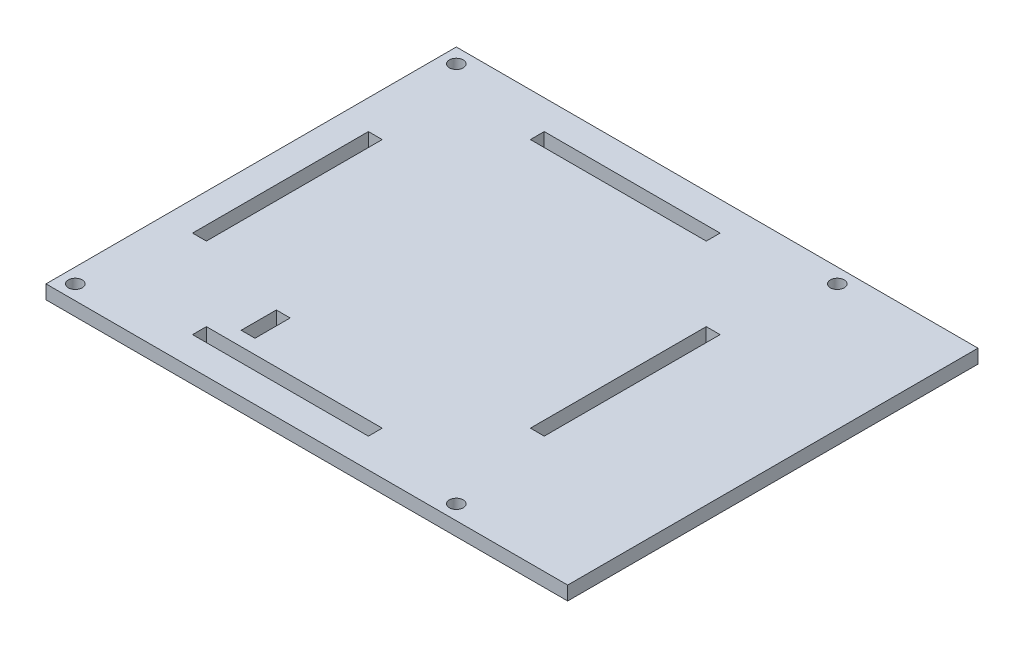
ISO-10303-21;
HEADER;
FILE_DESCRIPTION(('STEP AP214'),'2;1');
FILE_NAME('part.step','',(''),(''),'','','');
FILE_SCHEMA(('AUTOMOTIVE_DESIGN { 1 0 10303 214 1 1 1 1 }'));
ENDSEC;
DATA;
#1=APPLICATION_CONTEXT('core data for automotive mechanical design processes');
#2=APPLICATION_PROTOCOL_DEFINITION('international standard','automotive_design',2000,#1);
#3=PRODUCT_CONTEXT('',#1,'mechanical');
#4=PRODUCT('Part','Part','',(#3));
#5=PRODUCT_RELATED_PRODUCT_CATEGORY('part','',(#4));
#6=PRODUCT_DEFINITION_FORMATION('','',#4);
#7=PRODUCT_DEFINITION_CONTEXT('part definition',#1,'design');
#8=PRODUCT_DEFINITION('design','',#6,#7);
#9=PRODUCT_DEFINITION_SHAPE('','',#8);
#10=(LENGTH_UNIT() NAMED_UNIT(*) SI_UNIT(.MILLI.,.METRE.));
#11=(NAMED_UNIT(*) PLANE_ANGLE_UNIT() SI_UNIT($,.RADIAN.));
#12=(NAMED_UNIT(*) SI_UNIT($,.STERADIAN.) SOLID_ANGLE_UNIT());
#13=UNCERTAINTY_MEASURE_WITH_UNIT(LENGTH_MEASURE(1.E-05),#10,'distance_accuracy_value','');
#14=(GEOMETRIC_REPRESENTATION_CONTEXT(3) GLOBAL_UNCERTAINTY_ASSIGNED_CONTEXT((#13)) GLOBAL_UNIT_ASSIGNED_CONTEXT((#10,
#11,#12)) REPRESENTATION_CONTEXT('',''));
#15=CARTESIAN_POINT('',(0.,0.,0.));
#16=DIRECTION('',(0.,0.,1.));
#17=DIRECTION('',(1.,0.,0.));
#18=AXIS2_PLACEMENT_3D('',#15,#16,#17);
#19=CARTESIAN_POINT('',(0.,3.,0.));
#20=DIRECTION('',(0.,-1.,0.));
#21=DIRECTION('',(0.,0.,-1.));
#22=AXIS2_PLACEMENT_3D('',#19,#20,#21);
#23=PLANE('',#22);
#24=DIRECTION('',(0.,0.,1.));
#25=VECTOR('',#24,1.);
#26=CARTESIAN_POINT('',(-14.6000000000003,3.,24.4002499999995));
#27=LINE('',#26,#25);
#28=CARTESIAN_POINT('',(-14.6000000000003,3.,24.4002499999995));
#29=VERTEX_POINT('',#28);
#30=CARTESIAN_POINT('',(-14.6000000000003,3.,32.0202499999995));
#31=VERTEX_POINT('',#30);
#32=EDGE_CURVE('E234',#29,#31,#27,.T.);
#33=ORIENTED_EDGE('',*,*,#32,.F.);
#34=DIRECTION('',(-1.,0.,0.));
#35=VECTOR('',#34,1.);
#36=CARTESIAN_POINT('',(-14.6000000000003,3.,24.4002499999995));
#37=LINE('',#36,#35);
#38=CARTESIAN_POINT('',(-11.6000000000003,3.,24.4002499999995));
#39=VERTEX_POINT('',#38);
#40=EDGE_CURVE('E224',#39,#29,#37,.T.);
#41=ORIENTED_EDGE('',*,*,#40,.F.);
#42=DIRECTION('',(0.,0.,-1.));
#43=VECTOR('',#42,1.);
#44=CARTESIAN_POINT('',(-11.6000000000003,3.,24.4002499999995));
#45=LINE('',#44,#43);
#46=CARTESIAN_POINT('',(-11.6000000000003,3.,32.0202499999995));
#47=VERTEX_POINT('',#46);
#48=EDGE_CURVE('E238',#47,#39,#45,.T.);
#49=ORIENTED_EDGE('',*,*,#48,.F.);
#50=DIRECTION('',(1.,0.,0.));
#51=VECTOR('',#50,1.);
#52=CARTESIAN_POINT('',(-14.6000000000003,3.,32.0202499999995));
#53=LINE('',#52,#51);
#54=EDGE_CURVE('E60',#31,#47,#53,.T.);
#55=ORIENTED_EDGE('',*,*,#54,.F.);
#56=EDGE_LOOP('',(#33,#41,#49,#55));
#57=FACE_BOUND('',#56,.T.);
#58=DIRECTION('',(1.,0.,0.));
#59=VECTOR('',#58,1.);
#60=CARTESIAN_POINT('',(19.05,3.,38.0999999999995));
#61=LINE('',#60,#59);
#62=CARTESIAN_POINT('',(-19.05,3.,38.0999999999995));
#63=VERTEX_POINT('',#62);
#64=CARTESIAN_POINT('',(19.05,3.,38.0999999999995));
#65=VERTEX_POINT('',#64);
#66=EDGE_CURVE('E312',#63,#65,#61,.T.);
#67=ORIENTED_EDGE('',*,*,#66,.F.);
#68=DIRECTION('',(0.,0.,1.));
#69=VECTOR('',#68,1.);
#70=CARTESIAN_POINT('',(-19.05,3.,35.0999999999995));
#71=LINE('',#70,#69);
#72=CARTESIAN_POINT('',(-19.05,3.,35.0999999999995));
#73=VERTEX_POINT('',#72);
#74=EDGE_CURVE('E323',#73,#63,#71,.T.);
#75=ORIENTED_EDGE('',*,*,#74,.F.);
#76=DIRECTION('',(-1.,0.,0.));
#77=VECTOR('',#76,1.);
#78=CARTESIAN_POINT('',(19.05,3.,35.0999999999995));
#79=LINE('',#78,#77);
#80=CARTESIAN_POINT('',(19.05,3.,35.0999999999995));
#81=VERTEX_POINT('',#80);
#82=EDGE_CURVE('E319',#81,#73,#79,.T.);
#83=ORIENTED_EDGE('',*,*,#82,.F.);
#84=DIRECTION('',(0.,0.,-1.));
#85=VECTOR('',#84,1.);
#86=CARTESIAN_POINT('',(19.05,3.,35.0999999999995));
#87=LINE('',#86,#85);
#88=EDGE_CURVE('E315',#65,#81,#87,.T.);
#89=ORIENTED_EDGE('',*,*,#88,.F.);
#90=EDGE_LOOP('',(#67,#75,#83,#89));
#91=FACE_BOUND('',#90,.T.);
#92=CARTESIAN_POINT('',(-41.2750000000004,3.,41.2749999999996));
#93=DIRECTION('',(0.,1.,0.));
#94=DIRECTION('',(0.,0.,1.));
#95=AXIS2_PLACEMENT_3D('',#92,#93,#94);
#96=CIRCLE('',#95,1.50000000000001);
#97=CARTESIAN_POINT('',(-41.2750000000004,3.,42.7749999999996));
#98=VERTEX_POINT('',#97);
#99=EDGE_CURVE('E398',#98,#98,#96,.T.);
#100=ORIENTED_EDGE('',*,*,#99,.F.);
#101=EDGE_LOOP('',(#100));
#102=FACE_BOUND('',#101,.T.);
#103=CARTESIAN_POINT('',(41.275,3.,41.2749999999999));
#104=DIRECTION('',(0.,1.,0.));
#105=DIRECTION('',(0.,0.,1.));
#106=AXIS2_PLACEMENT_3D('',#103,#104,#105);
#107=CIRCLE('',#106,1.50000000000039);
#108=CARTESIAN_POINT('',(41.275,3.,42.7750000000003));
#109=VERTEX_POINT('',#108);
#110=EDGE_CURVE('E406',#109,#109,#107,.T.);
#111=ORIENTED_EDGE('',*,*,#110,.F.);
#112=EDGE_LOOP('',(#111));
#113=FACE_BOUND('',#112,.T.);
#114=CARTESIAN_POINT('',(41.2750000000002,3.,-41.2749999999999));
#115=DIRECTION('',(0.,1.,0.));
#116=DIRECTION('',(0.,0.,1.));
#117=AXIS2_PLACEMENT_3D('',#114,#115,#116);
#118=CIRCLE('',#117,1.5);
#119=CARTESIAN_POINT('',(41.2750000000002,3.,-39.7749999999999));
#120=VERTEX_POINT('',#119);
#121=EDGE_CURVE('E414',#120,#120,#118,.T.);
#122=ORIENTED_EDGE('',*,*,#121,.F.);
#123=EDGE_LOOP('',(#122));
#124=FACE_BOUND('',#123,.T.);
#125=CARTESIAN_POINT('',(-41.275,3.,-41.2750000000001));
#126=DIRECTION('',(0.,1.,0.));
#127=DIRECTION('',(0.,0.,1.));
#128=AXIS2_PLACEMENT_3D('',#125,#126,#127);
#129=CIRCLE('',#128,1.49999999999997);
#130=CARTESIAN_POINT('',(-41.275,3.,-39.7750000000001));
#131=VERTEX_POINT('',#130);
#132=EDGE_CURVE('E422',#131,#131,#129,.T.);
#133=ORIENTED_EDGE('',*,*,#132,.F.);
#134=EDGE_LOOP('',(#133));
#135=FACE_BOUND('',#134,.T.);
#136=DIRECTION('',(0.,0.,-1.));
#137=VECTOR('',#136,1.);
#138=CARTESIAN_POINT('',(19.049999999999,3.,-35.1));
#139=LINE('',#138,#137);
#140=CARTESIAN_POINT('',(19.049999999999,3.,-35.1));
#141=VERTEX_POINT('',#140);
#142=CARTESIAN_POINT('',(19.049999999999,3.,-38.1));
#143=VERTEX_POINT('',#142);
#144=EDGE_CURVE('E430',#141,#143,#139,.T.);
#145=ORIENTED_EDGE('',*,*,#144,.F.);
#146=DIRECTION('',(1.,0.,0.));
#147=VECTOR('',#146,1.);
#148=CARTESIAN_POINT('',(-19.050000000001,3.,-35.1));
#149=LINE('',#148,#147);
#150=CARTESIAN_POINT('',(-19.050000000001,3.,-35.1));
#151=VERTEX_POINT('',#150);
#152=EDGE_CURVE('E441',#151,#141,#149,.T.);
#153=ORIENTED_EDGE('',*,*,#152,.F.);
#154=DIRECTION('',(0.,0.,1.));
#155=VECTOR('',#154,1.);
#156=CARTESIAN_POINT('',(-19.050000000001,3.,-35.1));
#157=LINE('',#156,#155);
#158=CARTESIAN_POINT('',(-19.050000000001,3.,-38.1));
#159=VERTEX_POINT('',#158);
#160=EDGE_CURVE('E437',#159,#151,#157,.T.);
#161=ORIENTED_EDGE('',*,*,#160,.F.);
#162=DIRECTION('',(-1.,0.,0.));
#163=VECTOR('',#162,1.);
#164=CARTESIAN_POINT('',(-19.050000000001,3.,-38.1));
#165=LINE('',#164,#163);
#166=EDGE_CURVE('E433',#143,#159,#165,.T.);
#167=ORIENTED_EDGE('',*,*,#166,.F.);
#168=EDGE_LOOP('',(#145,#153,#161,#167));
#169=FACE_BOUND('',#168,.T.);
#170=DIRECTION('',(1.,0.,0.));
#171=VECTOR('',#170,1.);
#172=CARTESIAN_POINT('',(-44.45,3.,44.45));
#173=LINE('',#172,#171);
#174=CARTESIAN_POINT('',(-44.45,3.,44.45));
#175=VERTEX_POINT('',#174);
#176=CARTESIAN_POINT('',(68.58,3.,44.45));
#177=VERTEX_POINT('',#176);
#178=EDGE_CURVE('E480',#175,#177,#173,.T.);
#179=ORIENTED_EDGE('',*,*,#178,.T.);
#180=DIRECTION('',(0.,0.,1.));
#181=VECTOR('',#180,1.);
#182=CARTESIAN_POINT('',(68.58,3.,-44.45));
#183=LINE('',#182,#181);
#184=CARTESIAN_POINT('',(68.58,3.,-44.45));
#185=VERTEX_POINT('',#184);
#186=EDGE_CURVE('E264',#185,#177,#183,.T.);
#187=ORIENTED_EDGE('',*,*,#186,.F.);
#188=DIRECTION('',(-1.,0.,0.));
#189=VECTOR('',#188,1.);
#190=CARTESIAN_POINT('',(-44.45,3.,-44.45));
#191=LINE('',#190,#189);
#192=CARTESIAN_POINT('',(-44.45,3.,-44.45));
#193=VERTEX_POINT('',#192);
#194=EDGE_CURVE('E473',#185,#193,#191,.T.);
#195=ORIENTED_EDGE('',*,*,#194,.T.);
#196=DIRECTION('',(0.,0.,1.));
#197=VECTOR('',#196,1.);
#198=CARTESIAN_POINT('',(-44.45,3.,44.45));
#199=LINE('',#198,#197);
#200=EDGE_CURVE('E476',#193,#175,#199,.T.);
#201=ORIENTED_EDGE('',*,*,#200,.T.);
#202=EDGE_LOOP('',(#179,#187,#195,#201));
#203=FACE_BOUND('',#202,.T.);
#204=DIRECTION('',(0.,0.,-1.));
#205=VECTOR('',#204,1.);
#206=CARTESIAN_POINT('',(38.0999999999992,3.,-19.0500000000008));
#207=LINE('',#206,#205);
#208=CARTESIAN_POINT('',(38.0999999999992,3.,19.0499999999992));
#209=VERTEX_POINT('',#208);
#210=CARTESIAN_POINT('',(38.0999999999992,3.,-19.0500000000008));
#211=VERTEX_POINT('',#210);
#212=EDGE_CURVE('E355',#209,#211,#207,.T.);
#213=ORIENTED_EDGE('',*,*,#212,.F.);
#214=DIRECTION('',(1.,0.,0.));
#215=VECTOR('',#214,1.);
#216=CARTESIAN_POINT('',(35.0999999999992,3.,19.0499999999992));
#217=LINE('',#216,#215);
#218=CARTESIAN_POINT('',(35.0999999999992,3.,19.0499999999992));
#219=VERTEX_POINT('',#218);
#220=EDGE_CURVE('E366',#219,#209,#217,.T.);
#221=ORIENTED_EDGE('',*,*,#220,.F.);
#222=DIRECTION('',(0.,0.,1.));
#223=VECTOR('',#222,1.);
#224=CARTESIAN_POINT('',(35.0999999999992,3.,-19.0500000000008));
#225=LINE('',#224,#223);
#226=CARTESIAN_POINT('',(35.0999999999992,3.,-19.0500000000008));
#227=VERTEX_POINT('',#226);
#228=EDGE_CURVE('E362',#227,#219,#225,.T.);
#229=ORIENTED_EDGE('',*,*,#228,.F.);
#230=DIRECTION('',(-1.,0.,0.));
#231=VECTOR('',#230,1.);
#232=CARTESIAN_POINT('',(35.0999999999992,3.,-19.0500000000008));
#233=LINE('',#232,#231);
#234=EDGE_CURVE('E358',#211,#227,#233,.T.);
#235=ORIENTED_EDGE('',*,*,#234,.F.);
#236=EDGE_LOOP('',(#213,#221,#229,#235));
#237=FACE_BOUND('',#236,.T.);
#238=DIRECTION('',(0.,0.,1.));
#239=VECTOR('',#238,1.);
#240=CARTESIAN_POINT('',(-38.1000000000003,3.,19.0500000000003));
#241=LINE('',#240,#239);
#242=CARTESIAN_POINT('',(-38.0999999999998,3.,-19.0500000000004));
#243=VERTEX_POINT('',#242);
#244=CARTESIAN_POINT('',(-38.1000000000003,3.,19.0500000000003));
#245=VERTEX_POINT('',#244);
#246=EDGE_CURVE('E269',#243,#245,#241,.T.);
#247=ORIENTED_EDGE('',*,*,#246,.F.);
#248=DIRECTION('',(-1.,0.,0.));
#249=VECTOR('',#248,1.);
#250=CARTESIAN_POINT('',(-35.0999999999998,3.,-19.0500000000004));
#251=LINE('',#250,#249);
#252=CARTESIAN_POINT('',(-35.0999999999998,3.,-19.0500000000004));
#253=VERTEX_POINT('',#252);
#254=EDGE_CURVE('E280',#253,#243,#251,.T.);
#255=ORIENTED_EDGE('',*,*,#254,.F.);
#256=DIRECTION('',(0.,0.,-1.));
#257=VECTOR('',#256,1.);
#258=CARTESIAN_POINT('',(-35.1000000000003,3.,19.0500000000003));
#259=LINE('',#258,#257);
#260=CARTESIAN_POINT('',(-35.1000000000003,3.,19.0500000000003));
#261=VERTEX_POINT('',#260);
#262=EDGE_CURVE('E276',#261,#253,#259,.T.);
#263=ORIENTED_EDGE('',*,*,#262,.F.);
#264=DIRECTION('',(1.,0.,0.));
#265=VECTOR('',#264,1.);
#266=CARTESIAN_POINT('',(-35.1000000000003,3.,19.0500000000003));
#267=LINE('',#266,#265);
#268=EDGE_CURVE('E272',#245,#261,#267,.T.);
#269=ORIENTED_EDGE('',*,*,#268,.F.);
#270=EDGE_LOOP('',(#247,#255,#263,#269));
#271=FACE_BOUND('',#270,.T.);
#272=ADVANCED_FACE('F44',(#57,#91,#102,#113,#124,#135,#169,#203,#237,#271),#23,.F.);
#273=CARTESIAN_POINT('',(0.,0.,0.));
#274=DIRECTION('',(0.,-1.,0.));
#275=DIRECTION('',(0.,0.,-1.));
#276=AXIS2_PLACEMENT_3D('',#273,#274,#275);
#277=PLANE('',#276);
#278=DIRECTION('',(-1.,0.,0.));
#279=VECTOR('',#278,1.);
#280=CARTESIAN_POINT('',(-14.6000000000003,0.,24.4002499999995));
#281=LINE('',#280,#279);
#282=CARTESIAN_POINT('',(-11.6000000000003,0.,24.4002499999995));
#283=VERTEX_POINT('',#282);
#284=CARTESIAN_POINT('',(-14.6000000000003,0.,24.4002499999995));
#285=VERTEX_POINT('',#284);
#286=EDGE_CURVE('E221',#283,#285,#281,.T.);
#287=ORIENTED_EDGE('',*,*,#286,.T.);
#288=DIRECTION('',(0.,0.,1.));
#289=VECTOR('',#288,1.);
#290=CARTESIAN_POINT('',(-14.6000000000003,0.,24.4002499999995));
#291=LINE('',#290,#289);
#292=CARTESIAN_POINT('',(-14.6000000000003,0.,32.0202499999995));
#293=VERTEX_POINT('',#292);
#294=EDGE_CURVE('E207',#285,#293,#291,.T.);
#295=ORIENTED_EDGE('',*,*,#294,.T.);
#296=DIRECTION('',(1.,0.,0.));
#297=VECTOR('',#296,1.);
#298=CARTESIAN_POINT('',(-14.6000000000003,0.,32.0202499999995));
#299=LINE('',#298,#297);
#300=CARTESIAN_POINT('',(-11.6000000000003,0.,32.0202499999995));
#301=VERTEX_POINT('',#300);
#302=EDGE_CURVE('E243',#293,#301,#299,.T.);
#303=ORIENTED_EDGE('',*,*,#302,.T.);
#304=DIRECTION('',(0.,0.,-1.));
#305=VECTOR('',#304,1.);
#306=CARTESIAN_POINT('',(-11.6000000000003,0.,24.4002499999995));
#307=LINE('',#306,#305);
#308=EDGE_CURVE('E230',#301,#283,#307,.T.);
#309=ORIENTED_EDGE('',*,*,#308,.T.);
#310=EDGE_LOOP('',(#287,#295,#303,#309));
#311=FACE_BOUND('',#310,.T.);
#312=CARTESIAN_POINT('',(41.275,0.,41.2749999999999));
#313=DIRECTION('',(0.,1.,0.));
#314=DIRECTION('',(0.,0.,1.));
#315=AXIS2_PLACEMENT_3D('',#312,#313,#314);
#316=CIRCLE('',#315,1.50000000000039);
#317=CARTESIAN_POINT('',(41.275,0.,42.7750000000003));
#318=VERTEX_POINT('',#317);
#319=EDGE_CURVE('E402',#318,#318,#316,.T.);
#320=ORIENTED_EDGE('',*,*,#319,.T.);
#321=EDGE_LOOP('',(#320));
#322=FACE_BOUND('',#321,.T.);
#323=CARTESIAN_POINT('',(-41.275,0.,-41.2750000000001));
#324=DIRECTION('',(0.,1.,0.));
#325=DIRECTION('',(0.,0.,1.));
#326=AXIS2_PLACEMENT_3D('',#323,#324,#325);
#327=CIRCLE('',#326,1.49999999999997);
#328=CARTESIAN_POINT('',(-41.275,0.,-39.7750000000001));
#329=VERTEX_POINT('',#328);
#330=EDGE_CURVE('E418',#329,#329,#327,.T.);
#331=ORIENTED_EDGE('',*,*,#330,.T.);
#332=EDGE_LOOP('',(#331));
#333=FACE_BOUND('',#332,.T.);
#334=DIRECTION('',(-1.,0.,0.));
#335=VECTOR('',#334,1.);
#336=CARTESIAN_POINT('',(-44.45,0.,-44.45));
#337=LINE('',#336,#335);
#338=CARTESIAN_POINT('',(68.58,0.,-44.45));
#339=VERTEX_POINT('',#338);
#340=CARTESIAN_POINT('',(-44.45,0.,-44.45));
#341=VERTEX_POINT('',#340);
#342=EDGE_CURVE('E472',#339,#341,#337,.T.);
#343=ORIENTED_EDGE('',*,*,#342,.F.);
#344=DIRECTION('',(0.,0.,-1.));
#345=VECTOR('',#344,1.);
#346=CARTESIAN_POINT('',(68.58,0.,44.45));
#347=LINE('',#346,#345);
#348=CARTESIAN_POINT('',(68.58,0.,44.45));
#349=VERTEX_POINT('',#348);
#350=EDGE_CURVE('E256',#349,#339,#347,.T.);
#351=ORIENTED_EDGE('',*,*,#350,.F.);
#352=DIRECTION('',(1.,0.,0.));
#353=VECTOR('',#352,1.);
#354=CARTESIAN_POINT('',(-44.45,0.,44.45));
#355=LINE('',#354,#353);
#356=CARTESIAN_POINT('',(-44.45,0.,44.45));
#357=VERTEX_POINT('',#356);
#358=EDGE_CURVE('E477',#357,#349,#355,.T.);
#359=ORIENTED_EDGE('',*,*,#358,.F.);
#360=DIRECTION('',(0.,0.,1.));
#361=VECTOR('',#360,1.);
#362=CARTESIAN_POINT('',(-44.45,0.,44.45));
#363=LINE('',#362,#361);
#364=EDGE_CURVE('E485',#341,#357,#363,.T.);
#365=ORIENTED_EDGE('',*,*,#364,.F.);
#366=EDGE_LOOP('',(#343,#351,#359,#365));
#367=FACE_BOUND('',#366,.T.);
#368=DIRECTION('',(1.,0.,0.));
#369=VECTOR('',#368,1.);
#370=CARTESIAN_POINT('',(-19.050000000001,0.,-35.1));
#371=LINE('',#370,#369);
#372=CARTESIAN_POINT('',(-19.050000000001,0.,-35.1));
#373=VERTEX_POINT('',#372);
#374=CARTESIAN_POINT('',(19.049999999999,0.,-35.1));
#375=VERTEX_POINT('',#374);
#376=EDGE_CURVE('E434',#373,#375,#371,.T.);
#377=ORIENTED_EDGE('',*,*,#376,.T.);
#378=DIRECTION('',(0.,0.,-1.));
#379=VECTOR('',#378,1.);
#380=CARTESIAN_POINT('',(19.049999999999,0.,-35.1));
#381=LINE('',#380,#379);
#382=CARTESIAN_POINT('',(19.049999999999,0.,-38.1));
#383=VERTEX_POINT('',#382);
#384=EDGE_CURVE('E426',#375,#383,#381,.T.);
#385=ORIENTED_EDGE('',*,*,#384,.T.);
#386=DIRECTION('',(-1.,0.,0.));
#387=VECTOR('',#386,1.);
#388=CARTESIAN_POINT('',(-19.050000000001,0.,-38.1));
#389=LINE('',#388,#387);
#390=CARTESIAN_POINT('',(-19.050000000001,0.,-38.1));
#391=VERTEX_POINT('',#390);
#392=EDGE_CURVE('E448',#383,#391,#389,.T.);
#393=ORIENTED_EDGE('',*,*,#392,.T.);
#394=DIRECTION('',(0.,0.,1.));
#395=VECTOR('',#394,1.);
#396=CARTESIAN_POINT('',(-19.050000000001,0.,-35.1));
#397=LINE('',#396,#395);
#398=EDGE_CURVE('E452',#391,#373,#397,.T.);
#399=ORIENTED_EDGE('',*,*,#398,.T.);
#400=EDGE_LOOP('',(#377,#385,#393,#399));
#401=FACE_BOUND('',#400,.T.);
#402=CARTESIAN_POINT('',(41.2750000000002,0.,-41.2749999999999));
#403=DIRECTION('',(0.,1.,0.));
#404=DIRECTION('',(0.,0.,1.));
#405=AXIS2_PLACEMENT_3D('',#402,#403,#404);
#406=CIRCLE('',#405,1.5);
#407=CARTESIAN_POINT('',(41.2750000000002,0.,-39.7749999999999));
#408=VERTEX_POINT('',#407);
#409=EDGE_CURVE('E410',#408,#408,#406,.T.);
#410=ORIENTED_EDGE('',*,*,#409,.T.);
#411=EDGE_LOOP('',(#410));
#412=FACE_BOUND('',#411,.T.);
#413=CARTESIAN_POINT('',(-41.2750000000004,0.,41.2749999999996));
#414=DIRECTION('',(0.,1.,0.));
#415=DIRECTION('',(0.,0.,1.));
#416=AXIS2_PLACEMENT_3D('',#413,#414,#415);
#417=CIRCLE('',#416,1.50000000000001);
#418=CARTESIAN_POINT('',(-41.2750000000004,0.,42.7749999999996));
#419=VERTEX_POINT('',#418);
#420=EDGE_CURVE('E397',#419,#419,#417,.T.);
#421=ORIENTED_EDGE('',*,*,#420,.T.);
#422=EDGE_LOOP('',(#421));
#423=FACE_BOUND('',#422,.T.);
#424=DIRECTION('',(1.,0.,0.));
#425=VECTOR('',#424,1.);
#426=CARTESIAN_POINT('',(35.0999999999992,0.,19.0499999999992));
#427=LINE('',#426,#425);
#428=CARTESIAN_POINT('',(35.0999999999992,0.,19.0499999999992));
#429=VERTEX_POINT('',#428);
#430=CARTESIAN_POINT('',(38.0999999999992,0.,19.0499999999992));
#431=VERTEX_POINT('',#430);
#432=EDGE_CURVE('E359',#429,#431,#427,.T.);
#433=ORIENTED_EDGE('',*,*,#432,.T.);
#434=DIRECTION('',(0.,0.,-1.));
#435=VECTOR('',#434,1.);
#436=CARTESIAN_POINT('',(38.0999999999992,0.,-19.0500000000008));
#437=LINE('',#436,#435);
#438=CARTESIAN_POINT('',(38.0999999999992,0.,-19.0500000000008));
#439=VERTEX_POINT('',#438);
#440=EDGE_CURVE('E354',#431,#439,#437,.T.);
#441=ORIENTED_EDGE('',*,*,#440,.T.);
#442=DIRECTION('',(-1.,0.,0.));
#443=VECTOR('',#442,1.);
#444=CARTESIAN_POINT('',(35.0999999999992,0.,-19.0500000000008));
#445=LINE('',#444,#443);
#446=CARTESIAN_POINT('',(35.0999999999992,0.,-19.0500000000008));
#447=VERTEX_POINT('',#446);
#448=EDGE_CURVE('E373',#439,#447,#445,.T.);
#449=ORIENTED_EDGE('',*,*,#448,.T.);
#450=DIRECTION('',(0.,0.,1.));
#451=VECTOR('',#450,1.);
#452=CARTESIAN_POINT('',(35.0999999999992,0.,-19.0500000000008));
#453=LINE('',#452,#451);
#454=EDGE_CURVE('E377',#447,#429,#453,.T.);
#455=ORIENTED_EDGE('',*,*,#454,.T.);
#456=EDGE_LOOP('',(#433,#441,#449,#455));
#457=FACE_BOUND('',#456,.T.);
#458=DIRECTION('',(0.,0.,1.));
#459=VECTOR('',#458,1.);
#460=CARTESIAN_POINT('',(-19.05,0.,35.0999999999995));
#461=LINE('',#460,#459);
#462=CARTESIAN_POINT('',(-19.05,0.,35.0999999999995));
#463=VERTEX_POINT('',#462);
#464=CARTESIAN_POINT('',(-19.05,0.,38.0999999999995));
#465=VERTEX_POINT('',#464);
#466=EDGE_CURVE('E316',#463,#465,#461,.T.);
#467=ORIENTED_EDGE('',*,*,#466,.T.);
#468=DIRECTION('',(1.,0.,0.));
#469=VECTOR('',#468,1.);
#470=CARTESIAN_POINT('',(19.05,0.,38.0999999999995));
#471=LINE('',#470,#469);
#472=CARTESIAN_POINT('',(19.05,0.,38.0999999999995));
#473=VERTEX_POINT('',#472);
#474=EDGE_CURVE('E311',#465,#473,#471,.T.);
#475=ORIENTED_EDGE('',*,*,#474,.T.);
#476=DIRECTION('',(0.,0.,-1.));
#477=VECTOR('',#476,1.);
#478=CARTESIAN_POINT('',(19.05,0.,35.0999999999995));
#479=LINE('',#478,#477);
#480=CARTESIAN_POINT('',(19.05,0.,35.0999999999995));
#481=VERTEX_POINT('',#480);
#482=EDGE_CURVE('E330',#473,#481,#479,.T.);
#483=ORIENTED_EDGE('',*,*,#482,.T.);
#484=DIRECTION('',(-1.,0.,0.));
#485=VECTOR('',#484,1.);
#486=CARTESIAN_POINT('',(19.05,0.,35.0999999999995));
#487=LINE('',#486,#485);
#488=EDGE_CURVE('E334',#481,#463,#487,.T.);
#489=ORIENTED_EDGE('',*,*,#488,.T.);
#490=EDGE_LOOP('',(#467,#475,#483,#489));
#491=FACE_BOUND('',#490,.T.);
#492=DIRECTION('',(-1.,0.,0.));
#493=VECTOR('',#492,1.);
#494=CARTESIAN_POINT('',(-35.0999999999998,0.,-19.0500000000004));
#495=LINE('',#494,#493);
#496=CARTESIAN_POINT('',(-35.0999999999998,0.,-19.0500000000004));
#497=VERTEX_POINT('',#496);
#498=CARTESIAN_POINT('',(-38.0999999999998,0.,-19.0500000000004));
#499=VERTEX_POINT('',#498);
#500=EDGE_CURVE('E273',#497,#499,#495,.T.);
#501=ORIENTED_EDGE('',*,*,#500,.T.);
#502=DIRECTION('',(0.,0.,1.));
#503=VECTOR('',#502,1.);
#504=CARTESIAN_POINT('',(-38.1000000000003,0.,19.0500000000003));
#505=LINE('',#504,#503);
#506=CARTESIAN_POINT('',(-38.1000000000003,0.,19.0500000000003));
#507=VERTEX_POINT('',#506);
#508=EDGE_CURVE('E268',#499,#507,#505,.T.);
#509=ORIENTED_EDGE('',*,*,#508,.T.);
#510=DIRECTION('',(1.,0.,0.));
#511=VECTOR('',#510,1.);
#512=CARTESIAN_POINT('',(-35.1000000000003,0.,19.0500000000003));
#513=LINE('',#512,#511);
#514=CARTESIAN_POINT('',(-35.1000000000003,0.,19.0500000000003));
#515=VERTEX_POINT('',#514);
#516=EDGE_CURVE('E287',#507,#515,#513,.T.);
#517=ORIENTED_EDGE('',*,*,#516,.T.);
#518=DIRECTION('',(0.,0.,-1.));
#519=VECTOR('',#518,1.);
#520=CARTESIAN_POINT('',(-35.1000000000003,0.,19.0500000000003));
#521=LINE('',#520,#519);
#522=EDGE_CURVE('E291',#515,#497,#521,.T.);
#523=ORIENTED_EDGE('',*,*,#522,.T.);
#524=EDGE_LOOP('',(#501,#509,#517,#523));
#525=FACE_BOUND('',#524,.T.);
#526=ADVANCED_FACE('F228',(#311,#322,#333,#367,#401,#412,#423,#457,#491,#525),#277,.T.);
#527=CARTESIAN_POINT('',(-44.45,3.,-44.45));
#528=DIRECTION('',(0.,0.,1.));
#529=DIRECTION('',(1.,0.,0.));
#530=AXIS2_PLACEMENT_3D('',#527,#528,#529);
#531=PLANE('',#530);
#532=ORIENTED_EDGE('',*,*,#342,.T.);
#533=DIRECTION('',(0.,-1.,0.));
#534=VECTOR('',#533,1.);
#535=CARTESIAN_POINT('',(-44.45,3.,-44.45));
#536=LINE('',#535,#534);
#537=EDGE_CURVE('E11',#193,#341,#536,.T.);
#538=ORIENTED_EDGE('',*,*,#537,.F.);
#539=ORIENTED_EDGE('',*,*,#194,.F.);
#540=DIRECTION('',(0.,1.,0.));
#541=VECTOR('',#540,1.);
#542=CARTESIAN_POINT('',(68.58,0.,-44.45));
#543=LINE('',#542,#541);
#544=EDGE_CURVE('E260',#339,#185,#543,.T.);
#545=ORIENTED_EDGE('',*,*,#544,.F.);
#546=EDGE_LOOP('',(#532,#538,#539,#545));
#547=FACE_BOUND('',#546,.T.);
#548=ADVANCED_FACE('F46',(#547),#531,.F.);
#549=CARTESIAN_POINT('',(-44.45,3.,44.45));
#550=DIRECTION('',(1.,0.,0.));
#551=DIRECTION('',(0.,0.,-1.));
#552=AXIS2_PLACEMENT_3D('',#549,#550,#551);
#553=PLANE('',#552);
#554=ORIENTED_EDGE('',*,*,#364,.T.);
#555=DIRECTION('',(0.,-1.,0.));
#556=VECTOR('',#555,1.);
#557=CARTESIAN_POINT('',(-44.45,3.,44.45));
#558=LINE('',#557,#556);
#559=EDGE_CURVE('E53',#175,#357,#558,.T.);
#560=ORIENTED_EDGE('',*,*,#559,.F.);
#561=ORIENTED_EDGE('',*,*,#200,.F.);
#562=ORIENTED_EDGE('',*,*,#537,.T.);
#563=EDGE_LOOP('',(#554,#560,#561,#562));
#564=FACE_BOUND('',#563,.T.);
#565=ADVANCED_FACE('F510',(#564),#553,.F.);
#566=CARTESIAN_POINT('',(-44.45,3.,44.45));
#567=DIRECTION('',(0.,0.,-1.));
#568=DIRECTION('',(-1.,0.,0.));
#569=AXIS2_PLACEMENT_3D('',#566,#567,#568);
#570=PLANE('',#569);
#571=ORIENTED_EDGE('',*,*,#358,.T.);
#572=DIRECTION('',(0.,-1.,0.));
#573=VECTOR('',#572,1.);
#574=CARTESIAN_POINT('',(68.58,3.,44.45));
#575=LINE('',#574,#573);
#576=EDGE_CURVE('E252',#177,#349,#575,.T.);
#577=ORIENTED_EDGE('',*,*,#576,.F.);
#578=ORIENTED_EDGE('',*,*,#178,.F.);
#579=ORIENTED_EDGE('',*,*,#559,.T.);
#580=EDGE_LOOP('',(#571,#577,#578,#579));
#581=FACE_BOUND('',#580,.T.);
#582=ADVANCED_FACE('F495',(#581),#570,.F.);
#583=CARTESIAN_POINT('',(19.049999999999,3.,-35.1));
#584=DIRECTION('',(-1.,0.,0.));
#585=DIRECTION('',(0.,0.,1.));
#586=AXIS2_PLACEMENT_3D('',#583,#584,#585);
#587=PLANE('',#586);
#588=ORIENTED_EDGE('',*,*,#384,.F.);
#589=DIRECTION('',(0.,-1.,0.));
#590=VECTOR('',#589,1.);
#591=CARTESIAN_POINT('',(19.049999999999,3.,-35.1));
#592=LINE('',#591,#590);
#593=EDGE_CURVE('E444',#141,#375,#592,.T.);
#594=ORIENTED_EDGE('',*,*,#593,.F.);
#595=ORIENTED_EDGE('',*,*,#144,.T.);
#596=DIRECTION('',(0.,-1.,0.));
#597=VECTOR('',#596,1.);
#598=CARTESIAN_POINT('',(19.049999999999,3.,-38.1));
#599=LINE('',#598,#597);
#600=EDGE_CURVE('E468',#143,#383,#599,.T.);
#601=ORIENTED_EDGE('',*,*,#600,.T.);
#602=EDGE_LOOP('',(#588,#594,#595,#601));
#603=FACE_BOUND('',#602,.T.);
#604=ADVANCED_FACE('F527',(#603),#587,.T.);
#605=CARTESIAN_POINT('',(-19.050000000001,3.,-38.1));
#606=DIRECTION('',(0.,0.,1.));
#607=DIRECTION('',(1.,0.,0.));
#608=AXIS2_PLACEMENT_3D('',#605,#606,#607);
#609=PLANE('',#608);
#610=ORIENTED_EDGE('',*,*,#392,.F.);
#611=ORIENTED_EDGE('',*,*,#600,.F.);
#612=ORIENTED_EDGE('',*,*,#166,.T.);
#613=DIRECTION('',(0.,-1.,0.));
#614=VECTOR('',#613,1.);
#615=CARTESIAN_POINT('',(-19.050000000001,3.,-38.1));
#616=LINE('',#615,#614);
#617=EDGE_CURVE('E465',#159,#391,#616,.T.);
#618=ORIENTED_EDGE('',*,*,#617,.T.);
#619=EDGE_LOOP('',(#610,#611,#612,#618));
#620=FACE_BOUND('',#619,.T.);
#621=ADVANCED_FACE('F534',(#620),#609,.T.);
#622=CARTESIAN_POINT('',(-19.050000000001,3.,-35.1));
#623=DIRECTION('',(1.,0.,0.));
#624=DIRECTION('',(0.,0.,-1.));
#625=AXIS2_PLACEMENT_3D('',#622,#623,#624);
#626=PLANE('',#625);
#627=ORIENTED_EDGE('',*,*,#398,.F.);
#628=ORIENTED_EDGE('',*,*,#617,.F.);
#629=ORIENTED_EDGE('',*,*,#160,.T.);
#630=DIRECTION('',(0.,-1.,0.));
#631=VECTOR('',#630,1.);
#632=CARTESIAN_POINT('',(-19.050000000001,3.,-35.1));
#633=LINE('',#632,#631);
#634=EDGE_CURVE('E462',#151,#373,#633,.T.);
#635=ORIENTED_EDGE('',*,*,#634,.T.);
#636=EDGE_LOOP('',(#627,#628,#629,#635));
#637=FACE_BOUND('',#636,.T.);
#638=ADVANCED_FACE('F539',(#637),#626,.T.);
#639=CARTESIAN_POINT('',(-19.050000000001,3.,-35.1));
#640=DIRECTION('',(0.,0.,-1.));
#641=DIRECTION('',(-1.,0.,0.));
#642=AXIS2_PLACEMENT_3D('',#639,#640,#641);
#643=PLANE('',#642);
#644=ORIENTED_EDGE('',*,*,#376,.F.);
#645=ORIENTED_EDGE('',*,*,#634,.F.);
#646=ORIENTED_EDGE('',*,*,#152,.T.);
#647=ORIENTED_EDGE('',*,*,#593,.T.);
#648=EDGE_LOOP('',(#644,#645,#646,#647));
#649=FACE_BOUND('',#648,.T.);
#650=ADVANCED_FACE('F546',(#649),#643,.T.);
#651=CARTESIAN_POINT('',(-41.275,3.,-41.2750000000001));
#652=DIRECTION('',(0.,-1.,0.));
#653=DIRECTION('',(0.,0.,-1.));
#654=AXIS2_PLACEMENT_3D('',#651,#652,#653);
#655=CYLINDRICAL_SURFACE('',#654,1.49999999999997);
#656=ORIENTED_EDGE('',*,*,#132,.T.);
#657=EDGE_LOOP('',(#656));
#658=FACE_BOUND('',#657,.T.);
#659=ORIENTED_EDGE('',*,*,#330,.F.);
#660=EDGE_LOOP('',(#659));
#661=FACE_BOUND('',#660,.T.);
#662=ADVANCED_FACE('F560',(#658,#661),#655,.F.);
#663=CARTESIAN_POINT('',(41.2750000000002,3.,-41.2749999999999));
#664=DIRECTION('',(0.,-1.,0.));
#665=DIRECTION('',(0.,0.,-1.));
#666=AXIS2_PLACEMENT_3D('',#663,#664,#665);
#667=CYLINDRICAL_SURFACE('',#666,1.5);
#668=ORIENTED_EDGE('',*,*,#121,.T.);
#669=EDGE_LOOP('',(#668));
#670=FACE_BOUND('',#669,.T.);
#671=ORIENTED_EDGE('',*,*,#409,.F.);
#672=EDGE_LOOP('',(#671));
#673=FACE_BOUND('',#672,.T.);
#674=ADVANCED_FACE('F565',(#670,#673),#667,.F.);
#675=CARTESIAN_POINT('',(41.275,3.,41.2749999999999));
#676=DIRECTION('',(0.,-1.,0.));
#677=DIRECTION('',(0.,0.,-1.));
#678=AXIS2_PLACEMENT_3D('',#675,#676,#677);
#679=CYLINDRICAL_SURFACE('',#678,1.50000000000039);
#680=ORIENTED_EDGE('',*,*,#110,.T.);
#681=EDGE_LOOP('',(#680));
#682=FACE_BOUND('',#681,.T.);
#683=ORIENTED_EDGE('',*,*,#319,.F.);
#684=EDGE_LOOP('',(#683));
#685=FACE_BOUND('',#684,.T.);
#686=ADVANCED_FACE('F569',(#682,#685),#679,.F.);
#687=CARTESIAN_POINT('',(-41.2750000000004,3.,41.2749999999996));
#688=DIRECTION('',(0.,-1.,0.));
#689=DIRECTION('',(0.,0.,-1.));
#690=AXIS2_PLACEMENT_3D('',#687,#688,#689);
#691=CYLINDRICAL_SURFACE('',#690,1.50000000000001);
#692=ORIENTED_EDGE('',*,*,#99,.T.);
#693=EDGE_LOOP('',(#692));
#694=FACE_BOUND('',#693,.T.);
#695=ORIENTED_EDGE('',*,*,#420,.F.);
#696=EDGE_LOOP('',(#695));
#697=FACE_BOUND('',#696,.T.);
#698=ADVANCED_FACE('F573',(#694,#697),#691,.F.);
#699=CARTESIAN_POINT('',(38.0999999999992,3.,-19.0500000000008));
#700=DIRECTION('',(-1.,0.,0.));
#701=DIRECTION('',(0.,0.,1.));
#702=AXIS2_PLACEMENT_3D('',#699,#700,#701);
#703=PLANE('',#702);
#704=ORIENTED_EDGE('',*,*,#440,.F.);
#705=DIRECTION('',(0.,-1.,0.));
#706=VECTOR('',#705,1.);
#707=CARTESIAN_POINT('',(38.0999999999992,3.,19.0499999999992));
#708=LINE('',#707,#706);
#709=EDGE_CURVE('E369',#209,#431,#708,.T.);
#710=ORIENTED_EDGE('',*,*,#709,.F.);
#711=ORIENTED_EDGE('',*,*,#212,.T.);
#712=DIRECTION('',(0.,-1.,0.));
#713=VECTOR('',#712,1.);
#714=CARTESIAN_POINT('',(38.0999999999992,3.,-19.0500000000008));
#715=LINE('',#714,#713);
#716=EDGE_CURVE('E393',#211,#439,#715,.T.);
#717=ORIENTED_EDGE('',*,*,#716,.T.);
#718=EDGE_LOOP('',(#704,#710,#711,#717));
#719=FACE_BOUND('',#718,.T.);
#720=ADVANCED_FACE('F577',(#719),#703,.T.);
#721=CARTESIAN_POINT('',(35.0999999999992,3.,-19.0500000000008));
#722=DIRECTION('',(0.,0.,1.));
#723=DIRECTION('',(1.,0.,0.));
#724=AXIS2_PLACEMENT_3D('',#721,#722,#723);
#725=PLANE('',#724);
#726=ORIENTED_EDGE('',*,*,#448,.F.);
#727=ORIENTED_EDGE('',*,*,#716,.F.);
#728=ORIENTED_EDGE('',*,*,#234,.T.);
#729=DIRECTION('',(0.,-1.,0.));
#730=VECTOR('',#729,1.);
#731=CARTESIAN_POINT('',(35.0999999999992,3.,-19.0500000000008));
#732=LINE('',#731,#730);
#733=EDGE_CURVE('E390',#227,#447,#732,.T.);
#734=ORIENTED_EDGE('',*,*,#733,.T.);
#735=EDGE_LOOP('',(#726,#727,#728,#734));
#736=FACE_BOUND('',#735,.T.);
#737=ADVANCED_FACE('F581',(#736),#725,.T.);
#738=CARTESIAN_POINT('',(35.0999999999992,3.,-19.0500000000008));
#739=DIRECTION('',(1.,0.,0.));
#740=DIRECTION('',(0.,0.,-1.));
#741=AXIS2_PLACEMENT_3D('',#738,#739,#740);
#742=PLANE('',#741);
#743=ORIENTED_EDGE('',*,*,#454,.F.);
#744=ORIENTED_EDGE('',*,*,#733,.F.);
#745=ORIENTED_EDGE('',*,*,#228,.T.);
#746=DIRECTION('',(0.,-1.,0.));
#747=VECTOR('',#746,1.);
#748=CARTESIAN_POINT('',(35.0999999999992,3.,19.0499999999992));
#749=LINE('',#748,#747);
#750=EDGE_CURVE('E387',#219,#429,#749,.T.);
#751=ORIENTED_EDGE('',*,*,#750,.T.);
#752=EDGE_LOOP('',(#743,#744,#745,#751));
#753=FACE_BOUND('',#752,.T.);
#754=ADVANCED_FACE('F585',(#753),#742,.T.);
#755=CARTESIAN_POINT('',(35.0999999999992,3.,19.0499999999992));
#756=DIRECTION('',(0.,0.,-1.));
#757=DIRECTION('',(-1.,0.,0.));
#758=AXIS2_PLACEMENT_3D('',#755,#756,#757);
#759=PLANE('',#758);
#760=ORIENTED_EDGE('',*,*,#432,.F.);
#761=ORIENTED_EDGE('',*,*,#750,.F.);
#762=ORIENTED_EDGE('',*,*,#220,.T.);
#763=ORIENTED_EDGE('',*,*,#709,.T.);
#764=EDGE_LOOP('',(#760,#761,#762,#763));
#765=FACE_BOUND('',#764,.T.);
#766=ADVANCED_FACE('F589',(#765),#759,.T.);
#767=CARTESIAN_POINT('',(19.05,3.,38.0999999999995));
#768=DIRECTION('',(0.,0.,-1.));
#769=DIRECTION('',(-1.,0.,0.));
#770=AXIS2_PLACEMENT_3D('',#767,#768,#769);
#771=PLANE('',#770);
#772=ORIENTED_EDGE('',*,*,#474,.F.);
#773=DIRECTION('',(0.,-1.,0.));
#774=VECTOR('',#773,1.);
#775=CARTESIAN_POINT('',(-19.05,3.,38.0999999999995));
#776=LINE('',#775,#774);
#777=EDGE_CURVE('E326',#63,#465,#776,.T.);
#778=ORIENTED_EDGE('',*,*,#777,.F.);
#779=ORIENTED_EDGE('',*,*,#66,.T.);
#780=DIRECTION('',(0.,-1.,0.));
#781=VECTOR('',#780,1.);
#782=CARTESIAN_POINT('',(19.05,3.,38.0999999999995));
#783=LINE('',#782,#781);
#784=EDGE_CURVE('E350',#65,#473,#783,.T.);
#785=ORIENTED_EDGE('',*,*,#784,.T.);
#786=EDGE_LOOP('',(#772,#778,#779,#785));
#787=FACE_BOUND('',#786,.T.);
#788=ADVANCED_FACE('F593',(#787),#771,.T.);
#789=CARTESIAN_POINT('',(19.05,3.,35.0999999999995));
#790=DIRECTION('',(-1.,0.,0.));
#791=DIRECTION('',(0.,0.,1.));
#792=AXIS2_PLACEMENT_3D('',#789,#790,#791);
#793=PLANE('',#792);
#794=ORIENTED_EDGE('',*,*,#482,.F.);
#795=ORIENTED_EDGE('',*,*,#784,.F.);
#796=ORIENTED_EDGE('',*,*,#88,.T.);
#797=DIRECTION('',(0.,-1.,0.));
#798=VECTOR('',#797,1.);
#799=CARTESIAN_POINT('',(19.05,3.,35.0999999999995));
#800=LINE('',#799,#798);
#801=EDGE_CURVE('E347',#81,#481,#800,.T.);
#802=ORIENTED_EDGE('',*,*,#801,.T.);
#803=EDGE_LOOP('',(#794,#795,#796,#802));
#804=FACE_BOUND('',#803,.T.);
#805=ADVANCED_FACE('F597',(#804),#793,.T.);
#806=CARTESIAN_POINT('',(19.05,3.,35.0999999999995));
#807=DIRECTION('',(0.,0.,1.));
#808=DIRECTION('',(1.,0.,0.));
#809=AXIS2_PLACEMENT_3D('',#806,#807,#808);
#810=PLANE('',#809);
#811=ORIENTED_EDGE('',*,*,#488,.F.);
#812=ORIENTED_EDGE('',*,*,#801,.F.);
#813=ORIENTED_EDGE('',*,*,#82,.T.);
#814=DIRECTION('',(0.,-1.,0.));
#815=VECTOR('',#814,1.);
#816=CARTESIAN_POINT('',(-19.05,3.,35.0999999999995));
#817=LINE('',#816,#815);
#818=EDGE_CURVE('E344',#73,#463,#817,.T.);
#819=ORIENTED_EDGE('',*,*,#818,.T.);
#820=EDGE_LOOP('',(#811,#812,#813,#819));
#821=FACE_BOUND('',#820,.T.);
#822=ADVANCED_FACE('F601',(#821),#810,.T.);
#823=CARTESIAN_POINT('',(-19.05,3.,35.0999999999995));
#824=DIRECTION('',(1.,0.,0.));
#825=DIRECTION('',(0.,0.,-1.));
#826=AXIS2_PLACEMENT_3D('',#823,#824,#825);
#827=PLANE('',#826);
#828=ORIENTED_EDGE('',*,*,#466,.F.);
#829=ORIENTED_EDGE('',*,*,#818,.F.);
#830=ORIENTED_EDGE('',*,*,#74,.T.);
#831=ORIENTED_EDGE('',*,*,#777,.T.);
#832=EDGE_LOOP('',(#828,#829,#830,#831));
#833=FACE_BOUND('',#832,.T.);
#834=ADVANCED_FACE('F605',(#833),#827,.T.);
#835=CARTESIAN_POINT('',(-38.1000000000003,3.,19.0500000000003));
#836=DIRECTION('',(1.,0.,0.));
#837=DIRECTION('',(0.,0.,-1.));
#838=AXIS2_PLACEMENT_3D('',#835,#836,#837);
#839=PLANE('',#838);
#840=ORIENTED_EDGE('',*,*,#508,.F.);
#841=DIRECTION('',(0.,-1.,0.));
#842=VECTOR('',#841,1.);
#843=CARTESIAN_POINT('',(-38.0999999999998,3.,-19.0500000000004));
#844=LINE('',#843,#842);
#845=EDGE_CURVE('E283',#243,#499,#844,.T.);
#846=ORIENTED_EDGE('',*,*,#845,.F.);
#847=ORIENTED_EDGE('',*,*,#246,.T.);
#848=DIRECTION('',(0.,-1.,0.));
#849=VECTOR('',#848,1.);
#850=CARTESIAN_POINT('',(-38.1000000000003,3.,19.0500000000003));
#851=LINE('',#850,#849);
#852=EDGE_CURVE('E307',#245,#507,#851,.T.);
#853=ORIENTED_EDGE('',*,*,#852,.T.);
#854=EDGE_LOOP('',(#840,#846,#847,#853));
#855=FACE_BOUND('',#854,.T.);
#856=ADVANCED_FACE('F609',(#855),#839,.T.);
#857=CARTESIAN_POINT('',(-35.1000000000003,3.,19.0500000000003));
#858=DIRECTION('',(0.,0.,-1.));
#859=DIRECTION('',(-1.,0.,0.));
#860=AXIS2_PLACEMENT_3D('',#857,#858,#859);
#861=PLANE('',#860);
#862=ORIENTED_EDGE('',*,*,#516,.F.);
#863=ORIENTED_EDGE('',*,*,#852,.F.);
#864=ORIENTED_EDGE('',*,*,#268,.T.);
#865=DIRECTION('',(0.,-1.,0.));
#866=VECTOR('',#865,1.);
#867=CARTESIAN_POINT('',(-35.1000000000003,3.,19.0500000000003));
#868=LINE('',#867,#866);
#869=EDGE_CURVE('E304',#261,#515,#868,.T.);
#870=ORIENTED_EDGE('',*,*,#869,.T.);
#871=EDGE_LOOP('',(#862,#863,#864,#870));
#872=FACE_BOUND('',#871,.T.);
#873=ADVANCED_FACE('F613',(#872),#861,.T.);
#874=CARTESIAN_POINT('',(-35.1000000000003,3.,19.0500000000003));
#875=DIRECTION('',(-1.,0.,0.));
#876=DIRECTION('',(0.,0.,1.));
#877=AXIS2_PLACEMENT_3D('',#874,#875,#876);
#878=PLANE('',#877);
#879=ORIENTED_EDGE('',*,*,#522,.F.);
#880=ORIENTED_EDGE('',*,*,#869,.F.);
#881=ORIENTED_EDGE('',*,*,#262,.T.);
#882=DIRECTION('',(0.,-1.,0.));
#883=VECTOR('',#882,1.);
#884=CARTESIAN_POINT('',(-35.0999999999998,3.,-19.0500000000004));
#885=LINE('',#884,#883);
#886=EDGE_CURVE('E301',#253,#497,#885,.T.);
#887=ORIENTED_EDGE('',*,*,#886,.T.);
#888=EDGE_LOOP('',(#879,#880,#881,#887));
#889=FACE_BOUND('',#888,.T.);
#890=ADVANCED_FACE('F617',(#889),#878,.T.);
#891=CARTESIAN_POINT('',(-35.0999999999998,3.,-19.0500000000004));
#892=DIRECTION('',(0.,0.,1.));
#893=DIRECTION('',(1.,0.,0.));
#894=AXIS2_PLACEMENT_3D('',#891,#892,#893);
#895=PLANE('',#894);
#896=ORIENTED_EDGE('',*,*,#500,.F.);
#897=ORIENTED_EDGE('',*,*,#886,.F.);
#898=ORIENTED_EDGE('',*,*,#254,.T.);
#899=ORIENTED_EDGE('',*,*,#845,.T.);
#900=EDGE_LOOP('',(#896,#897,#898,#899));
#901=FACE_BOUND('',#900,.T.);
#902=ADVANCED_FACE('F621',(#901),#895,.T.);
#903=CARTESIAN_POINT('',(68.58,0.,0.));
#904=DIRECTION('',(1.,0.,0.));
#905=DIRECTION('',(0.,0.,-1.));
#906=AXIS2_PLACEMENT_3D('',#903,#904,#905);
#907=PLANE('',#906);
#908=ORIENTED_EDGE('',*,*,#576,.T.);
#909=ORIENTED_EDGE('',*,*,#350,.T.);
#910=ORIENTED_EDGE('',*,*,#544,.T.);
#911=ORIENTED_EDGE('',*,*,#186,.T.);
#912=EDGE_LOOP('',(#908,#909,#910,#911));
#913=FACE_BOUND('',#912,.T.);
#914=ADVANCED_FACE('F505',(#913),#907,.T.);
#915=CARTESIAN_POINT('',(-14.6000000000003,-8.18928568313501,24.4002499999995));
#916=DIRECTION('',(0.,0.,-1.));
#917=DIRECTION('',(-1.,0.,0.));
#918=AXIS2_PLACEMENT_3D('',#915,#916,#917);
#919=PLANE('',#918);
#920=DIRECTION('',(0.,1.,0.));
#921=VECTOR('',#920,1.);
#922=CARTESIAN_POINT('',(-11.6000000000003,-8.18928568313501,24.4002499999995));
#923=LINE('',#922,#921);
#924=EDGE_CURVE('E68',#283,#39,#923,.T.);
#925=ORIENTED_EDGE('',*,*,#924,.T.);
#926=ORIENTED_EDGE('',*,*,#40,.T.);
#927=DIRECTION('',(0.,1.,0.));
#928=VECTOR('',#927,1.);
#929=CARTESIAN_POINT('',(-14.6000000000003,-8.18928568313501,24.4002499999995));
#930=LINE('',#929,#928);
#931=EDGE_CURVE('E211',#285,#29,#930,.T.);
#932=ORIENTED_EDGE('',*,*,#931,.F.);
#933=ORIENTED_EDGE('',*,*,#286,.F.);
#934=EDGE_LOOP('',(#925,#926,#932,#933));
#935=FACE_BOUND('',#934,.T.);
#936=ADVANCED_FACE('F220',(#935),#919,.F.);
#937=CARTESIAN_POINT('',(-14.6000000000003,-8.18928568313501,24.4002499999995));
#938=DIRECTION('',(-1.,0.,0.));
#939=DIRECTION('',(0.,0.,1.));
#940=AXIS2_PLACEMENT_3D('',#937,#938,#939);
#941=PLANE('',#940);
#942=ORIENTED_EDGE('',*,*,#931,.T.);
#943=ORIENTED_EDGE('',*,*,#32,.T.);
#944=DIRECTION('',(0.,1.,0.));
#945=VECTOR('',#944,1.);
#946=CARTESIAN_POINT('',(-14.6000000000003,-8.18928568313501,32.0202499999995));
#947=LINE('',#946,#945);
#948=EDGE_CURVE('E213',#293,#31,#947,.T.);
#949=ORIENTED_EDGE('',*,*,#948,.F.);
#950=ORIENTED_EDGE('',*,*,#294,.F.);
#951=EDGE_LOOP('',(#942,#943,#949,#950));
#952=FACE_BOUND('',#951,.T.);
#953=ADVANCED_FACE('F209',(#952),#941,.F.);
#954=CARTESIAN_POINT('',(-14.6000000000003,-8.18928568313501,32.0202499999995));
#955=DIRECTION('',(0.,0.,1.));
#956=DIRECTION('',(1.,0.,0.));
#957=AXIS2_PLACEMENT_3D('',#954,#955,#956);
#958=PLANE('',#957);
#959=ORIENTED_EDGE('',*,*,#948,.T.);
#960=ORIENTED_EDGE('',*,*,#54,.T.);
#961=DIRECTION('',(0.,1.,0.));
#962=VECTOR('',#961,1.);
#963=CARTESIAN_POINT('',(-11.6000000000003,-8.18928568313501,32.0202499999995));
#964=LINE('',#963,#962);
#965=EDGE_CURVE('E242',#301,#47,#964,.T.);
#966=ORIENTED_EDGE('',*,*,#965,.F.);
#967=ORIENTED_EDGE('',*,*,#302,.F.);
#968=EDGE_LOOP('',(#959,#960,#966,#967));
#969=FACE_BOUND('',#968,.T.);
#970=ADVANCED_FACE('F632',(#969),#958,.F.);
#971=CARTESIAN_POINT('',(-11.6000000000003,-8.18928568313501,24.4002499999995));
#972=DIRECTION('',(1.,0.,0.));
#973=DIRECTION('',(0.,0.,-1.));
#974=AXIS2_PLACEMENT_3D('',#971,#972,#973);
#975=PLANE('',#974);
#976=ORIENTED_EDGE('',*,*,#965,.T.);
#977=ORIENTED_EDGE('',*,*,#48,.T.);
#978=ORIENTED_EDGE('',*,*,#924,.F.);
#979=ORIENTED_EDGE('',*,*,#308,.F.);
#980=EDGE_LOOP('',(#976,#977,#978,#979));
#981=FACE_BOUND('',#980,.T.);
#982=ADVANCED_FACE('F635',(#981),#975,.F.);
#983=CLOSED_SHELL('',(#272,#526,#548,#565,#582,#604,#621,#638,#650,#662,#674,#686,#698,#720,
#737,#754,#766,#788,#805,#822,#834,#856,#873,#890,#902,#914,#936,#953,#970,#982));
#984=MANIFOLD_SOLID_BREP('B2',#983);
#985=ADVANCED_BREP_SHAPE_REPRESENTATION('',(#18,#984),#14);
#986=SHAPE_DEFINITION_REPRESENTATION(#9,#985);
ENDSEC;
END-ISO-10303-21;
